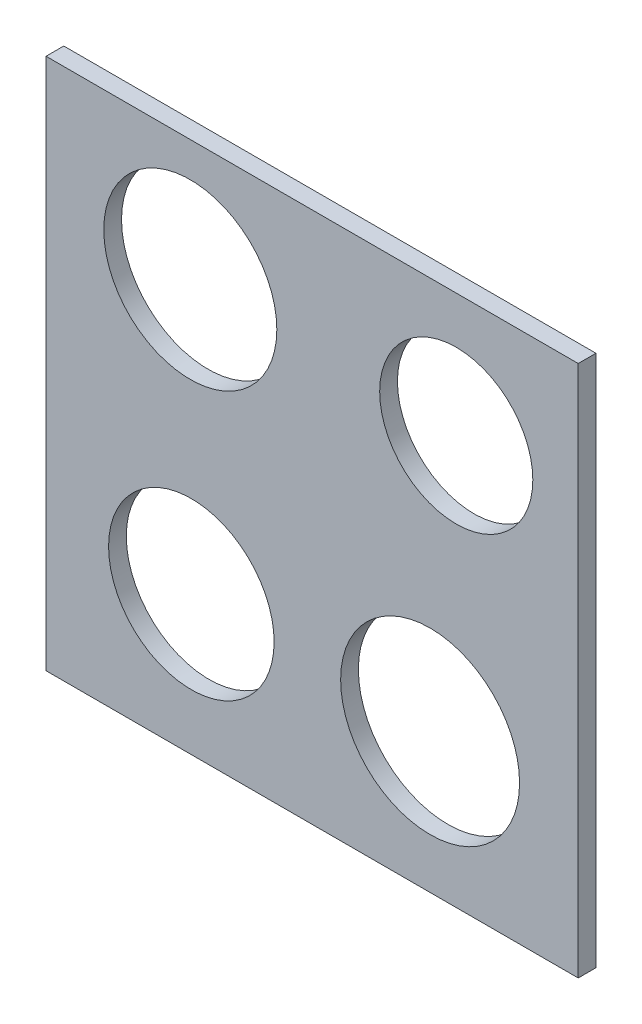
ISO-10303-21;
HEADER;
FILE_DESCRIPTION(('STEP AP214'),'2;1');
FILE_NAME('part.step','',(''),(''),'','','');
FILE_SCHEMA(('AUTOMOTIVE_DESIGN { 1 0 10303 214 1 1 1 1 }'));
ENDSEC;
DATA;
#1=APPLICATION_CONTEXT('core data for automotive mechanical design processes');
#2=APPLICATION_PROTOCOL_DEFINITION('international standard','automotive_design',2000,#1);
#3=PRODUCT_CONTEXT('',#1,'mechanical');
#4=PRODUCT('Part','Part','',(#3));
#5=PRODUCT_RELATED_PRODUCT_CATEGORY('part','',(#4));
#6=PRODUCT_DEFINITION_FORMATION('','',#4);
#7=PRODUCT_DEFINITION_CONTEXT('part definition',#1,'design');
#8=PRODUCT_DEFINITION('design','',#6,#7);
#9=PRODUCT_DEFINITION_SHAPE('','',#8);
#10=(LENGTH_UNIT() NAMED_UNIT(*) SI_UNIT(.MILLI.,.METRE.));
#11=(NAMED_UNIT(*) PLANE_ANGLE_UNIT() SI_UNIT($,.RADIAN.));
#12=(NAMED_UNIT(*) SI_UNIT($,.STERADIAN.) SOLID_ANGLE_UNIT());
#13=UNCERTAINTY_MEASURE_WITH_UNIT(LENGTH_MEASURE(1.E-05),#10,'distance_accuracy_value','');
#14=(GEOMETRIC_REPRESENTATION_CONTEXT(3) GLOBAL_UNCERTAINTY_ASSIGNED_CONTEXT((#13)) GLOBAL_UNIT_ASSIGNED_CONTEXT((#10,
#11,#12)) REPRESENTATION_CONTEXT('',''));
#15=CARTESIAN_POINT('',(0.,0.,0.));
#16=DIRECTION('',(0.,0.,1.));
#17=DIRECTION('',(1.,0.,0.));
#18=AXIS2_PLACEMENT_3D('',#15,#16,#17);
#19=CARTESIAN_POINT('',(15.,15.,1.));
#20=DIRECTION('',(-1.,0.,0.));
#21=DIRECTION('',(0.,-1.,0.));
#22=AXIS2_PLACEMENT_3D('',#19,#20,#21);
#23=PLANE('',#22);
#24=DIRECTION('',(0.,1.,0.));
#25=VECTOR('',#24,1.);
#26=CARTESIAN_POINT('',(15.,15.,0.));
#27=LINE('',#26,#25);
#28=CARTESIAN_POINT('',(15.,-15.,0.));
#29=VERTEX_POINT('',#28);
#30=CARTESIAN_POINT('',(15.,15.,0.));
#31=VERTEX_POINT('',#30);
#32=EDGE_CURVE('E96',#29,#31,#27,.T.);
#33=ORIENTED_EDGE('',*,*,#32,.T.);
#34=DIRECTION('',(0.,0.,-1.));
#35=VECTOR('',#34,1.);
#36=CARTESIAN_POINT('',(15.,15.,1.));
#37=LINE('',#36,#35);
#38=CARTESIAN_POINT('',(15.,15.,1.));
#39=VERTEX_POINT('',#38);
#40=EDGE_CURVE('E11',#39,#31,#37,.T.);
#41=ORIENTED_EDGE('',*,*,#40,.F.);
#42=DIRECTION('',(0.,1.,0.));
#43=VECTOR('',#42,1.);
#44=CARTESIAN_POINT('',(15.,15.,1.));
#45=LINE('',#44,#43);
#46=CARTESIAN_POINT('',(15.,-15.,1.));
#47=VERTEX_POINT('',#46);
#48=EDGE_CURVE('E84',#47,#39,#45,.T.);
#49=ORIENTED_EDGE('',*,*,#48,.F.);
#50=DIRECTION('',(0.,0.,-1.));
#51=VECTOR('',#50,1.);
#52=CARTESIAN_POINT('',(15.,-15.,1.));
#53=LINE('',#52,#51);
#54=EDGE_CURVE('E92',#47,#29,#53,.T.);
#55=ORIENTED_EDGE('',*,*,#54,.T.);
#56=EDGE_LOOP('',(#33,#41,#49,#55));
#57=FACE_BOUND('',#56,.T.);
#58=ADVANCED_FACE('F33',(#57),#23,.F.);
#59=CARTESIAN_POINT('',(-15.,15.,1.));
#60=DIRECTION('',(0.,-1.,0.));
#61=DIRECTION('',(0.,0.,-1.));
#62=AXIS2_PLACEMENT_3D('',#59,#60,#61);
#63=PLANE('',#62);
#64=DIRECTION('',(-1.,0.,0.));
#65=VECTOR('',#64,1.);
#66=CARTESIAN_POINT('',(-15.,15.,0.));
#67=LINE('',#66,#65);
#68=CARTESIAN_POINT('',(-15.,15.,0.));
#69=VERTEX_POINT('',#68);
#70=EDGE_CURVE('E88',#31,#69,#67,.T.);
#71=ORIENTED_EDGE('',*,*,#70,.T.);
#72=DIRECTION('',(0.,0.,-1.));
#73=VECTOR('',#72,1.);
#74=CARTESIAN_POINT('',(-15.,15.,1.));
#75=LINE('',#74,#73);
#76=CARTESIAN_POINT('',(-15.,15.,1.));
#77=VERTEX_POINT('',#76);
#78=EDGE_CURVE('E41',#77,#69,#75,.T.);
#79=ORIENTED_EDGE('',*,*,#78,.F.);
#80=DIRECTION('',(-1.,0.,0.));
#81=VECTOR('',#80,1.);
#82=CARTESIAN_POINT('',(-15.,15.,1.));
#83=LINE('',#82,#81);
#84=EDGE_CURVE('E79',#39,#77,#83,.T.);
#85=ORIENTED_EDGE('',*,*,#84,.F.);
#86=ORIENTED_EDGE('',*,*,#40,.T.);
#87=EDGE_LOOP('',(#71,#79,#85,#86));
#88=FACE_BOUND('',#87,.T.);
#89=ADVANCED_FACE('F87',(#88),#63,.F.);
#90=CARTESIAN_POINT('',(-15.,15.,1.));
#91=DIRECTION('',(1.,0.,0.));
#92=DIRECTION('',(0.,1.,0.));
#93=AXIS2_PLACEMENT_3D('',#90,#91,#92);
#94=PLANE('',#93);
#95=DIRECTION('',(0.,-1.,0.));
#96=VECTOR('',#95,1.);
#97=CARTESIAN_POINT('',(-15.,15.,0.));
#98=LINE('',#97,#96);
#99=CARTESIAN_POINT('',(-15.,-15.,0.));
#100=VERTEX_POINT('',#99);
#101=EDGE_CURVE('E66',#69,#100,#98,.T.);
#102=ORIENTED_EDGE('',*,*,#101,.T.);
#103=DIRECTION('',(0.,0.,-1.));
#104=VECTOR('',#103,1.);
#105=CARTESIAN_POINT('',(-15.,-15.,1.));
#106=LINE('',#105,#104);
#107=CARTESIAN_POINT('',(-15.,-15.,1.));
#108=VERTEX_POINT('',#107);
#109=EDGE_CURVE('E89',#108,#100,#106,.T.);
#110=ORIENTED_EDGE('',*,*,#109,.F.);
#111=DIRECTION('',(0.,-1.,0.));
#112=VECTOR('',#111,1.);
#113=CARTESIAN_POINT('',(-15.,15.,1.));
#114=LINE('',#113,#112);
#115=EDGE_CURVE('E82',#77,#108,#114,.T.);
#116=ORIENTED_EDGE('',*,*,#115,.F.);
#117=ORIENTED_EDGE('',*,*,#78,.T.);
#118=EDGE_LOOP('',(#102,#110,#116,#117));
#119=FACE_BOUND('',#118,.T.);
#120=ADVANCED_FACE('F90',(#119),#94,.F.);
#121=CARTESIAN_POINT('',(-15.,-15.,1.));
#122=DIRECTION('',(0.,1.,0.));
#123=DIRECTION('',(0.,0.,1.));
#124=AXIS2_PLACEMENT_3D('',#121,#122,#123);
#125=PLANE('',#124);
#126=DIRECTION('',(1.,0.,0.));
#127=VECTOR('',#126,1.);
#128=CARTESIAN_POINT('',(-15.,-15.,0.));
#129=LINE('',#128,#127);
#130=EDGE_CURVE('E72',#100,#29,#129,.T.);
#131=ORIENTED_EDGE('',*,*,#130,.T.);
#132=ORIENTED_EDGE('',*,*,#54,.F.);
#133=DIRECTION('',(1.,0.,0.));
#134=VECTOR('',#133,1.);
#135=CARTESIAN_POINT('',(-15.,-15.,1.));
#136=LINE('',#135,#134);
#137=EDGE_CURVE('E49',#108,#47,#136,.T.);
#138=ORIENTED_EDGE('',*,*,#137,.F.);
#139=ORIENTED_EDGE('',*,*,#109,.T.);
#140=EDGE_LOOP('',(#131,#132,#138,#139));
#141=FACE_BOUND('',#140,.T.);
#142=ADVANCED_FACE('F104',(#141),#125,.F.);
#143=CARTESIAN_POINT('',(0.,0.,1.));
#144=DIRECTION('',(0.,0.,1.));
#145=DIRECTION('',(1.,0.,0.));
#146=AXIS2_PLACEMENT_3D('',#143,#144,#145);
#147=PLANE('',#146);
#148=CARTESIAN_POINT('',(-6.80872850729486,-7.16530237733082,1.));
#149=DIRECTION('',(0.,0.,1.));
#150=DIRECTION('',(1.,0.,0.));
#151=AXIS2_PLACEMENT_3D('',#148,#149,#150);
#152=CIRCLE('',#151,4.6664313631316);
#153=CARTESIAN_POINT('',(-2.14229714416326,-7.16530237733082,1.));
#154=VERTEX_POINT('',#153);
#155=EDGE_CURVE('E127',#154,#154,#152,.T.);
#156=ORIENTED_EDGE('',*,*,#155,.F.);
#157=EDGE_LOOP('',(#156));
#158=FACE_BOUND('',#157,.T.);
#159=CARTESIAN_POINT('',(-6.86747489983475,8.16200161952452,1.));
#160=DIRECTION('',(0.,0.,1.));
#161=DIRECTION('',(1.,0.,0.));
#162=AXIS2_PLACEMENT_3D('',#159,#160,#161);
#163=CIRCLE('',#162,4.87742345686204);
#164=CARTESIAN_POINT('',(-1.99005144297271,8.16200161952452,1.));
#165=VERTEX_POINT('',#164);
#166=EDGE_CURVE('E121',#165,#165,#163,.T.);
#167=ORIENTED_EDGE('',*,*,#166,.F.);
#168=EDGE_LOOP('',(#167));
#169=FACE_BOUND('',#168,.T.);
#170=CARTESIAN_POINT('',(6.65027078881053,-7.13141992159194,1.));
#171=DIRECTION('',(0.,0.,1.));
#172=DIRECTION('',(1.,0.,0.));
#173=AXIS2_PLACEMENT_3D('',#170,#171,#172);
#174=CIRCLE('',#173,5.04313296052821);
#175=CARTESIAN_POINT('',(11.6934037493387,-7.13141992159194,1.));
#176=VERTEX_POINT('',#175);
#177=EDGE_CURVE('E115',#176,#176,#174,.T.);
#178=ORIENTED_EDGE('',*,*,#177,.F.);
#179=EDGE_LOOP('',(#178));
#180=FACE_BOUND('',#179,.T.);
#181=CARTESIAN_POINT('',(8.12429836997808,8.03899765790561,1.));
#182=DIRECTION('',(0.,0.,1.));
#183=DIRECTION('',(1.,0.,0.));
#184=AXIS2_PLACEMENT_3D('',#181,#182,#183);
#185=CIRCLE('',#184,4.31616382895669);
#186=CARTESIAN_POINT('',(12.4404621989348,8.03899765790561,1.));
#187=VERTEX_POINT('',#186);
#188=EDGE_CURVE('E99',#187,#187,#185,.T.);
#189=ORIENTED_EDGE('',*,*,#188,.F.);
#190=EDGE_LOOP('',(#189));
#191=FACE_BOUND('',#190,.T.);
#192=ORIENTED_EDGE('',*,*,#48,.T.);
#193=ORIENTED_EDGE('',*,*,#84,.T.);
#194=ORIENTED_EDGE('',*,*,#115,.T.);
#195=ORIENTED_EDGE('',*,*,#137,.T.);
#196=EDGE_LOOP('',(#192,#193,#194,#195));
#197=FACE_BOUND('',#196,.T.);
#198=ADVANCED_FACE('F80',(#158,#169,#180,#191,#197),#147,.T.);
#199=CARTESIAN_POINT('',(0.,0.,0.));
#200=DIRECTION('',(0.,0.,1.));
#201=DIRECTION('',(1.,0.,0.));
#202=AXIS2_PLACEMENT_3D('',#199,#200,#201);
#203=PLANE('',#202);
#204=CARTESIAN_POINT('',(-6.80872850729486,-7.16530237733082,0.));
#205=DIRECTION('',(0.,0.,-1.));
#206=DIRECTION('',(-1.,0.,0.));
#207=AXIS2_PLACEMENT_3D('',#204,#205,#206);
#208=CIRCLE('',#207,4.6664313631316);
#209=CARTESIAN_POINT('',(-11.4751598704265,-7.16530237733082,0.));
#210=VERTEX_POINT('',#209);
#211=EDGE_CURVE('E130',#210,#210,#208,.T.);
#212=ORIENTED_EDGE('',*,*,#211,.F.);
#213=EDGE_LOOP('',(#212));
#214=FACE_BOUND('',#213,.T.);
#215=CARTESIAN_POINT('',(-6.86747489983475,8.16200161952452,0.));
#216=DIRECTION('',(0.,0.,-1.));
#217=DIRECTION('',(-1.,0.,0.));
#218=AXIS2_PLACEMENT_3D('',#215,#216,#217);
#219=CIRCLE('',#218,4.87742345686204);
#220=CARTESIAN_POINT('',(-11.7448983566968,8.16200161952452,0.));
#221=VERTEX_POINT('',#220);
#222=EDGE_CURVE('E124',#221,#221,#219,.T.);
#223=ORIENTED_EDGE('',*,*,#222,.F.);
#224=EDGE_LOOP('',(#223));
#225=FACE_BOUND('',#224,.T.);
#226=CARTESIAN_POINT('',(6.65027078881053,-7.13141992159194,0.));
#227=DIRECTION('',(0.,0.,-1.));
#228=DIRECTION('',(-1.,0.,0.));
#229=AXIS2_PLACEMENT_3D('',#226,#227,#228);
#230=CIRCLE('',#229,5.04313296052821);
#231=CARTESIAN_POINT('',(1.60713782828232,-7.13141992159194,0.));
#232=VERTEX_POINT('',#231);
#233=EDGE_CURVE('E118',#232,#232,#230,.T.);
#234=ORIENTED_EDGE('',*,*,#233,.F.);
#235=EDGE_LOOP('',(#234));
#236=FACE_BOUND('',#235,.T.);
#237=CARTESIAN_POINT('',(8.12429836997808,8.03899765790561,0.));
#238=DIRECTION('',(0.,0.,-1.));
#239=DIRECTION('',(-1.,0.,0.));
#240=AXIS2_PLACEMENT_3D('',#237,#238,#239);
#241=CIRCLE('',#240,4.31616382895669);
#242=CARTESIAN_POINT('',(3.80813454102138,8.03899765790561,0.));
#243=VERTEX_POINT('',#242);
#244=EDGE_CURVE('E112',#243,#243,#241,.T.);
#245=ORIENTED_EDGE('',*,*,#244,.F.);
#246=EDGE_LOOP('',(#245));
#247=FACE_BOUND('',#246,.T.);
#248=ORIENTED_EDGE('',*,*,#32,.F.);
#249=ORIENTED_EDGE('',*,*,#130,.F.);
#250=ORIENTED_EDGE('',*,*,#101,.F.);
#251=ORIENTED_EDGE('',*,*,#70,.F.);
#252=EDGE_LOOP('',(#248,#249,#250,#251));
#253=FACE_BOUND('',#252,.T.);
#254=ADVANCED_FACE('F107',(#214,#225,#236,#247,#253),#203,.F.);
#255=CARTESIAN_POINT('',(8.12429836997808,8.03899765790561,3.));
#256=DIRECTION('',(0.,0.,-1.));
#257=DIRECTION('',(-1.,0.,0.));
#258=AXIS2_PLACEMENT_3D('',#255,#256,#257);
#259=CYLINDRICAL_SURFACE('',#258,4.31616382895669);
#260=ORIENTED_EDGE('',*,*,#188,.T.);
#261=EDGE_LOOP('',(#260));
#262=FACE_BOUND('',#261,.T.);
#263=ORIENTED_EDGE('',*,*,#244,.T.);
#264=EDGE_LOOP('',(#263));
#265=FACE_BOUND('',#264,.T.);
#266=ADVANCED_FACE('F138',(#262,#265),#259,.F.);
#267=CARTESIAN_POINT('',(6.65027078881053,-7.13141992159194,3.));
#268=DIRECTION('',(0.,0.,-1.));
#269=DIRECTION('',(-1.,0.,0.));
#270=AXIS2_PLACEMENT_3D('',#267,#268,#269);
#271=CYLINDRICAL_SURFACE('',#270,5.04313296052821);
#272=ORIENTED_EDGE('',*,*,#177,.T.);
#273=EDGE_LOOP('',(#272));
#274=FACE_BOUND('',#273,.T.);
#275=ORIENTED_EDGE('',*,*,#233,.T.);
#276=EDGE_LOOP('',(#275));
#277=FACE_BOUND('',#276,.T.);
#278=ADVANCED_FACE('F147',(#274,#277),#271,.F.);
#279=CARTESIAN_POINT('',(-6.86747489983475,8.16200161952452,3.));
#280=DIRECTION('',(0.,0.,-1.));
#281=DIRECTION('',(-1.,0.,0.));
#282=AXIS2_PLACEMENT_3D('',#279,#280,#281);
#283=CYLINDRICAL_SURFACE('',#282,4.87742345686204);
#284=ORIENTED_EDGE('',*,*,#166,.T.);
#285=EDGE_LOOP('',(#284));
#286=FACE_BOUND('',#285,.T.);
#287=ORIENTED_EDGE('',*,*,#222,.T.);
#288=EDGE_LOOP('',(#287));
#289=FACE_BOUND('',#288,.T.);
#290=ADVANCED_FACE('F154',(#286,#289),#283,.F.);
#291=CARTESIAN_POINT('',(-6.80872850729486,-7.16530237733082,3.));
#292=DIRECTION('',(0.,0.,-1.));
#293=DIRECTION('',(-1.,0.,0.));
#294=AXIS2_PLACEMENT_3D('',#291,#292,#293);
#295=CYLINDRICAL_SURFACE('',#294,4.6664313631316);
#296=ORIENTED_EDGE('',*,*,#155,.T.);
#297=EDGE_LOOP('',(#296));
#298=FACE_BOUND('',#297,.T.);
#299=ORIENTED_EDGE('',*,*,#211,.T.);
#300=EDGE_LOOP('',(#299));
#301=FACE_BOUND('',#300,.T.);
#302=ADVANCED_FACE('F134',(#298,#301),#295,.F.);
#303=CLOSED_SHELL('',(#58,#89,#120,#142,#198,#254,#266,#278,#290,#302));
#304=MANIFOLD_SOLID_BREP('B2',#303);
#305=ADVANCED_BREP_SHAPE_REPRESENTATION('',(#18,#304),#14);
#306=SHAPE_DEFINITION_REPRESENTATION(#9,#305);
ENDSEC;
END-ISO-10303-21;
